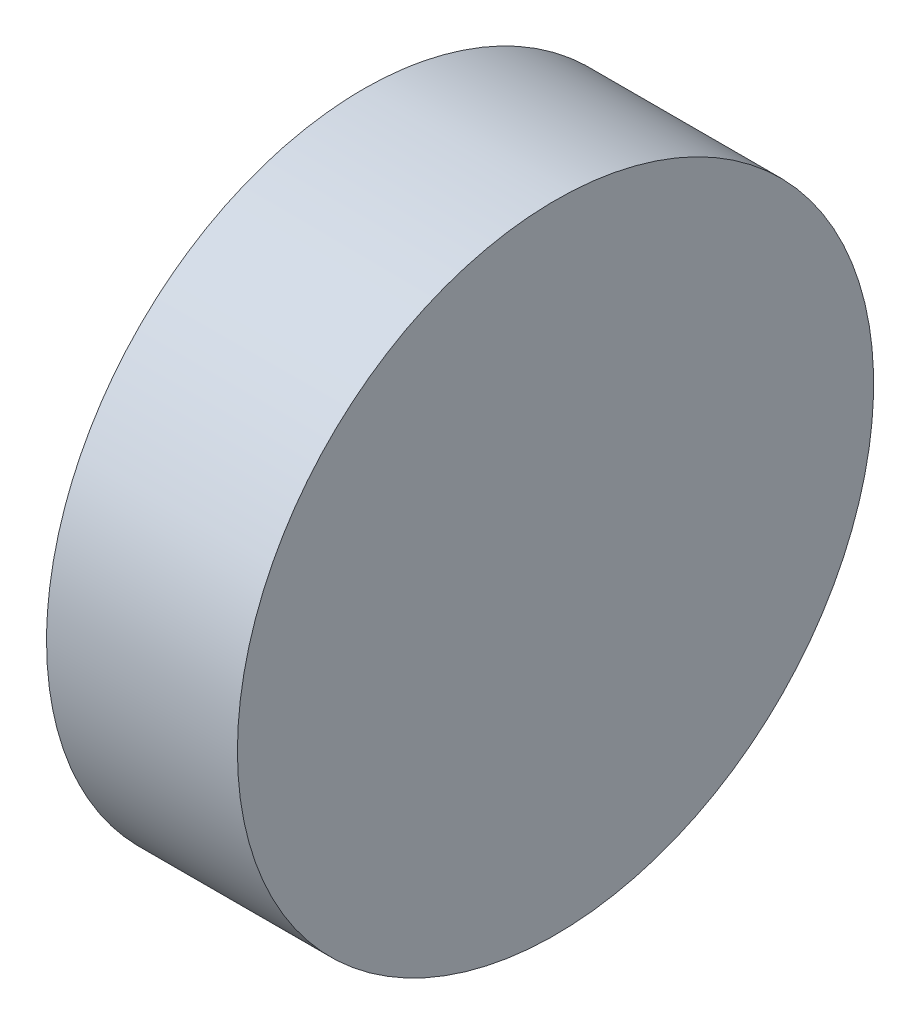
ISO-10303-21;
HEADER;
FILE_DESCRIPTION(('STEP AP214'),'2;1');
FILE_NAME('part.step','',(''),(''),'','','');
FILE_SCHEMA(('AUTOMOTIVE_DESIGN { 1 0 10303 214 1 1 1 1 }'));
ENDSEC;
DATA;
#1=APPLICATION_CONTEXT('core data for automotive mechanical design processes');
#2=APPLICATION_PROTOCOL_DEFINITION('international standard','automotive_design',2000,#1);
#3=PRODUCT_CONTEXT('',#1,'mechanical');
#4=PRODUCT('Part','Part','',(#3));
#5=PRODUCT_RELATED_PRODUCT_CATEGORY('part','',(#4));
#6=PRODUCT_DEFINITION_FORMATION('','',#4);
#7=PRODUCT_DEFINITION_CONTEXT('part definition',#1,'design');
#8=PRODUCT_DEFINITION('design','',#6,#7);
#9=PRODUCT_DEFINITION_SHAPE('','',#8);
#10=(LENGTH_UNIT() NAMED_UNIT(*) SI_UNIT(.MILLI.,.METRE.));
#11=(NAMED_UNIT(*) PLANE_ANGLE_UNIT() SI_UNIT($,.RADIAN.));
#12=(NAMED_UNIT(*) SI_UNIT($,.STERADIAN.) SOLID_ANGLE_UNIT());
#13=UNCERTAINTY_MEASURE_WITH_UNIT(LENGTH_MEASURE(1.E-05),#10,'distance_accuracy_value','');
#14=(GEOMETRIC_REPRESENTATION_CONTEXT(3) GLOBAL_UNCERTAINTY_ASSIGNED_CONTEXT((#13)) GLOBAL_UNIT_ASSIGNED_CONTEXT((#10,
#11,#12)) REPRESENTATION_CONTEXT('',''));
#15=CARTESIAN_POINT('',(0.,0.,0.));
#16=DIRECTION('',(0.,0.,1.));
#17=DIRECTION('',(1.,0.,0.));
#18=AXIS2_PLACEMENT_3D('',#15,#16,#17);
#19=CARTESIAN_POINT('',(290.,0.,0.));
#20=DIRECTION('',(-1.,0.,0.));
#21=DIRECTION('',(0.,0.,1.));
#22=AXIS2_PLACEMENT_3D('',#19,#20,#21);
#23=PLANE('',#22);
#24=CARTESIAN_POINT('',(290.,0.,0.));
#25=DIRECTION('',(-1.,0.,0.));
#26=DIRECTION('',(0.,0.,1.));
#27=AXIS2_PLACEMENT_3D('',#24,#25,#26);
#28=CIRCLE('',#27,5.00000000000005);
#29=CARTESIAN_POINT('',(290.,0.,5.00000000000005));
#30=VERTEX_POINT('',#29);
#31=EDGE_CURVE('E18',#30,#30,#28,.T.);
#32=ORIENTED_EDGE('',*,*,#31,.F.);
#33=EDGE_LOOP('',(#32));
#34=FACE_BOUND('',#33,.T.);
#35=ADVANCED_FACE('F15',(#34),#23,.F.);
#36=CARTESIAN_POINT('',(-290.,0.,0.));
#37=DIRECTION('',(-1.,0.,0.));
#38=DIRECTION('',(0.,0.,1.));
#39=AXIS2_PLACEMENT_3D('',#36,#37,#38);
#40=CYLINDRICAL_SURFACE('',#39,5.00000000000005);
#41=CARTESIAN_POINT('',(287.,0.,5.00000000000005));
#42=CARTESIAN_POINT('',(286.999999981893,-0.140367365878147,4.99999922560093));
#43=CARTESIAN_POINT('',(286.999948373774,-0.280760149727647,4.99408415602021));
#44=CARTESIAN_POINT('',(286.999743308953,-0.560605630915635,4.9704581632869));
#45=CARTESIAN_POINT('',(286.99958980206,-0.700057830749343,4.95274142709282));
#46=CARTESIAN_POINT('',(286.999184914271,-0.977216708563061,4.90559261925809));
#47=CARTESIAN_POINT('',(286.998933366381,-1.11491999214275,4.87614055683503));
#48=CARTESIAN_POINT('',(286.998339443499,-1.38740314511742,4.80571768010346));
#49=CARTESIAN_POINT('',(286.997997034341,-1.52218189417507,4.76474253258196));
#50=CARTESIAN_POINT('',(286.997231641569,-1.78764247682955,4.6716266135757));
#51=CARTESIAN_POINT('',(286.996808755776,-1.91832906221594,4.61949938814656));
#52=CARTESIAN_POINT('',(286.995893977859,-2.17489342489322,4.50439943164233));
#53=CARTESIAN_POINT('',(286.995402060321,-2.30076940924831,4.44142270415054));
#54=CARTESIAN_POINT('',(286.994363750313,-2.54666228729309,4.30514267669168));
#55=CARTESIAN_POINT('',(286.993817404082,-2.66668402730323,4.23184812042534));
#56=CARTESIAN_POINT('',(286.992685176768,-2.90017255382093,4.07538413874863));
#57=CARTESIAN_POINT('',(286.992099281172,-3.01363690520538,3.99221107948697));
#58=CARTESIAN_POINT('',(286.990904854575,-3.23313950079651,3.81661626742415));
#59=CARTESIAN_POINT('',(286.990296327014,-3.33917886682271,3.72419591691681));
#60=CARTESIAN_POINT('',(286.98907359239,-3.54313465798267,3.5307169391396));
#61=CARTESIAN_POINT('',(286.988459383312,-3.64104806880368,3.42965513430768));
#62=CARTESIAN_POINT('',(286.98724312,-3.82798547961291,3.21967098600279));
#63=CARTESIAN_POINT('',(286.986641062377,-3.91701198598186,3.11075087382904));
#64=CARTESIAN_POINT('',(286.985465790711,-4.08560554120724,2.88575750325287));
#65=CARTESIAN_POINT('',(286.984892587401,-4.16516908502915,2.76968161840834));
#66=CARTESIAN_POINT('',(286.983791759354,-4.31420348493938,2.53128440896953));
#67=CARTESIAN_POINT('',(286.983264116882,-4.38367827560253,2.40896554440237));
#68=CARTESIAN_POINT('',(286.982268942647,-4.51210203613593,2.15886683542454));
#69=CARTESIAN_POINT('',(286.981801433163,-4.57104710786912,2.03108499020655));
#70=CARTESIAN_POINT('',(286.98094021986,-4.67794075837642,1.77104907632847));
#71=CARTESIAN_POINT('',(286.980546487875,-4.72589353514795,1.63879673718229));
#72=CARTESIAN_POINT('',(286.979843560868,-4.81050406143394,1.37070835534393));
#73=CARTESIAN_POINT('',(286.97953439754,-4.84715757699518,1.23487098995195));
#74=CARTESIAN_POINT('',(286.978748253043,-4.93969382620417,0.823551460763388));
#75=CARTESIAN_POINT('',(286.978411630984,-4.9782706665177,0.543973005395459));
#76=CARTESIAN_POINT('',(286.97815417355,-5.0078710506189,-0.0176901866871297));
#77=CARTESIAN_POINT('',(286.978233338098,-4.99889460319082,-0.299774922938808));
#78=CARTESIAN_POINT('',(286.978655177376,-4.95010581369642,-0.718535537296324));
#79=CARTESIAN_POINT('',(286.978846484831,-4.92793473976195,-0.857465967581369));
#80=CARTESIAN_POINT('',(286.979324247417,-4.87197592568251,-1.13294880611333));
#81=CARTESIAN_POINT('',(286.979610666925,-4.83819253473607,-1.26950208459368));
#82=CARTESIAN_POINT('',(286.980270810566,-4.75922994560583,-1.53932004286248));
#83=CARTESIAN_POINT('',(286.98064456806,-4.71404639241269,-1.67258344446825));
#84=CARTESIAN_POINT('',(286.981468524065,-4.61263067204388,-1.93478331540616));
#85=CARTESIAN_POINT('',(286.981918694299,-4.55640259071734,-2.06372136428352));
#86=CARTESIAN_POINT('',(286.982883010634,-4.43326072631515,-2.31645596667914));
#87=CARTESIAN_POINT('',(286.983397183581,-4.36634245570501,-2.44025033335708));
#88=CARTESIAN_POINT('',(286.98447455179,-4.22233982777125,-2.68171575754857));
#89=CARTESIAN_POINT('',(286.985037728889,-4.14525923160632,-2.79938905815661));
#90=CARTESIAN_POINT('',(286.986197451543,-3.98143741938344,-3.02785742233571));
#91=CARTESIAN_POINT('',(286.986794006503,-3.89469347388024,-3.13865052874035));
#92=CARTESIAN_POINT('',(286.988003177378,-3.71221329777993,-3.3524949302646));
#93=CARTESIAN_POINT('',(286.988615787285,-3.61648039831559,-3.45554906801517));
#94=CARTESIAN_POINT('',(286.989840026499,-3.4166545642655,-3.65324918478189));
#95=CARTESIAN_POINT('',(286.990451655575,-3.31255989085782,-3.74789340630192));
#96=CARTESIAN_POINT('',(286.991656222016,-3.09680770107217,-3.92804347945882));
#97=CARTESIAN_POINT('',(286.992249166191,-2.9851529883206,-4.0135526887998));
#98=CARTESIAN_POINT('',(286.993400267328,-2.75494236868796,-4.17493345373213));
#99=CARTESIAN_POINT('',(286.993958394533,-2.6363807214862,-4.25079682115631));
#100=CARTESIAN_POINT('',(286.995023262765,-2.39333034842515,-4.39223543355226));
#101=CARTESIAN_POINT('',(286.995530022679,-2.26884382599115,-4.45781446483448));
#102=CARTESIAN_POINT('',(286.996478577897,-2.01463481093442,-4.5783246883899));
#103=CARTESIAN_POINT('',(286.996920293929,-1.88490617076017,-4.63324291327126));
#104=CARTESIAN_POINT('',(286.997725306109,-1.62132737083082,-4.73192266750009));
#105=CARTESIAN_POINT('',(286.998088631716,-1.48747878091829,-4.77568838877123));
#106=CARTESIAN_POINT('',(286.998726198293,-1.21680305996955,-4.85171311811144));
#107=CARTESIAN_POINT('',(286.999000590367,-1.07998140702315,-4.88399165286261));
#108=CARTESIAN_POINT('',(286.999453244809,-0.804160854022945,-4.93690484136047));
#109=CARTESIAN_POINT('',(286.999631554477,-0.665163059975374,-4.95754522452637));
#110=CARTESIAN_POINT('',(286.999839312139,-0.438291537270655,-4.98152665367857));
#111=CARTESIAN_POINT('',(286.999899505114,-0.3507811237414,-4.98845199450058));
#112=CARTESIAN_POINT('',(286.999979854705,-0.175517119000054,-4.99768890975715));
#113=CARTESIAN_POINT('',(287.000000011321,-0.0877635277876955,-5.00000048418666));
#114=CARTESIAN_POINT('',(286.999999981893,0.140367365878154,-4.99999922560093));
#115=CARTESIAN_POINT('',(286.999948373774,0.280760149727654,-4.99408415602021));
#116=CARTESIAN_POINT('',(286.999743308953,0.560605630915642,-4.97045816328689));
#117=CARTESIAN_POINT('',(286.99958980206,0.70005783074935,-4.95274142709281));
#118=CARTESIAN_POINT('',(286.999184914271,0.977216708563066,-4.90559261925807));
#119=CARTESIAN_POINT('',(286.998933366381,1.11491999214276,-4.87614055683501));
#120=CARTESIAN_POINT('',(286.998339443499,1.38740314511742,-4.80571768010343));
#121=CARTESIAN_POINT('',(286.997997034341,1.52218189417507,-4.76474253258194));
#122=CARTESIAN_POINT('',(286.997231641569,1.78764247682955,-4.67162661357567));
#123=CARTESIAN_POINT('',(286.996808755776,1.91832906221594,-4.61949938814652));
#124=CARTESIAN_POINT('',(286.995893977859,2.17489342489322,-4.50439943164229));
#125=CARTESIAN_POINT('',(286.995402060321,2.30076940924831,-4.4414227041505));
#126=CARTESIAN_POINT('',(286.994363750313,2.54666228729309,-4.30514267669163));
#127=CARTESIAN_POINT('',(286.993817404081,2.66668402730322,-4.23184812042529));
#128=CARTESIAN_POINT('',(286.992685176768,2.90017255382092,-4.07538413874858));
#129=CARTESIAN_POINT('',(286.992099281172,3.01363690520537,-3.99221107948692));
#130=CARTESIAN_POINT('',(286.990904854575,3.23313950079649,-3.81661626742409));
#131=CARTESIAN_POINT('',(286.990296327014,3.33917886682269,-3.72419591691675));
#132=CARTESIAN_POINT('',(286.98907359239,3.54313465798265,-3.53071693913954));
#133=CARTESIAN_POINT('',(286.988459383312,3.64104806880366,-3.42965513430762));
#134=CARTESIAN_POINT('',(286.98724312,3.82798547961288,-3.21967098600272));
#135=CARTESIAN_POINT('',(286.986641062377,3.91701198598183,-3.11075087382897));
#136=CARTESIAN_POINT('',(286.985465790711,4.08560554120721,-2.8857575032528));
#137=CARTESIAN_POINT('',(286.984892587401,4.16516908502912,-2.76968161840826));
#138=CARTESIAN_POINT('',(286.983791759354,4.31420348493935,-2.53128440896945));
#139=CARTESIAN_POINT('',(286.983264116882,4.38367827560249,-2.4089655444023));
#140=CARTESIAN_POINT('',(286.982268942647,4.51210203613589,-2.15886683542446));
#141=CARTESIAN_POINT('',(286.981801433163,4.57104710786907,-2.03108499020647));
#142=CARTESIAN_POINT('',(286.98094021986,4.67794075837637,-1.77104907632839));
#143=CARTESIAN_POINT('',(286.980546487875,4.7258935351479,-1.63879673718221));
#144=CARTESIAN_POINT('',(286.979843560868,4.81050406143388,-1.37070835534384));
#145=CARTESIAN_POINT('',(286.97953439754,4.84715757699512,-1.23487098995186));
#146=CARTESIAN_POINT('',(286.978748253043,4.9396938262041,-0.8235514607633));
#147=CARTESIAN_POINT('',(286.978411630984,4.97827066651763,-0.543973005395369));
#148=CARTESIAN_POINT('',(286.97815417355,5.00787105061882,0.0176901866872196));
#149=CARTESIAN_POINT('',(286.978233338098,4.99889460319073,0.299774922938897));
#150=CARTESIAN_POINT('',(286.978655177376,4.95010581369633,0.718535537296412));
#151=CARTESIAN_POINT('',(286.978846484831,4.92793473976185,0.857465967581457));
#152=CARTESIAN_POINT('',(286.979324247417,4.87197592568241,1.13294880611342));
#153=CARTESIAN_POINT('',(286.979610666925,4.83819253473596,1.26950208459377));
#154=CARTESIAN_POINT('',(286.980270810566,4.75922994560572,1.53932004286256));
#155=CARTESIAN_POINT('',(286.98064456806,4.71404639241258,1.67258344446833));
#156=CARTESIAN_POINT('',(286.981468524065,4.61263067204376,1.93478331540624));
#157=CARTESIAN_POINT('',(286.981918694299,4.55640259071722,2.0637213642836));
#158=CARTESIAN_POINT('',(286.982883010634,4.43326072631503,2.31645596667922));
#159=CARTESIAN_POINT('',(286.983397183581,4.36634245570489,2.44025033335716));
#160=CARTESIAN_POINT('',(286.98447455179,4.22233982777112,2.68171575754865));
#161=CARTESIAN_POINT('',(286.985037728889,4.14525923160619,2.79938905815669));
#162=CARTESIAN_POINT('',(286.986197451543,3.9814374193833,3.02785742233578));
#163=CARTESIAN_POINT('',(286.986794006503,3.8946934738801,3.13865052874041));
#164=CARTESIAN_POINT('',(286.988003177378,3.71221329777979,3.35249493026467));
#165=CARTESIAN_POINT('',(286.988615787285,3.61648039831544,3.45554906801523));
#166=CARTESIAN_POINT('',(286.989840026499,3.41665456426535,3.65324918478195));
#167=CARTESIAN_POINT('',(286.990451655575,3.31255989085767,3.74789340630198));
#168=CARTESIAN_POINT('',(286.991656222016,3.09680770107202,3.92804347945888));
#169=CARTESIAN_POINT('',(286.992249166191,2.98515298832045,4.01355268879986));
#170=CARTESIAN_POINT('',(286.993400267328,2.75494236868781,4.17493345373218));
#171=CARTESIAN_POINT('',(286.993958394533,2.63638072148604,4.25079682115636));
#172=CARTESIAN_POINT('',(286.995023262765,2.39333034842499,4.39223543355231));
#173=CARTESIAN_POINT('',(286.995530022679,2.26884382599099,4.45781446483452));
#174=CARTESIAN_POINT('',(286.996478577897,2.01463481093425,4.57832468838994));
#175=CARTESIAN_POINT('',(286.996920293929,1.88490617076,4.6332429132713));
#176=CARTESIAN_POINT('',(286.997725306109,1.62132737083065,4.73192266750012));
#177=CARTESIAN_POINT('',(286.998088631716,1.48747878091812,4.77568838877126));
#178=CARTESIAN_POINT('',(286.998726198293,1.21680305996938,4.85171311811146));
#179=CARTESIAN_POINT('',(286.999000590367,1.07998140702298,4.88399165286263));
#180=CARTESIAN_POINT('',(286.999453244809,0.804160854022774,4.93690484136048));
#181=CARTESIAN_POINT('',(286.999631554477,0.665163059975203,4.95754522452639));
#182=CARTESIAN_POINT('',(286.999839312139,0.438291537270513,4.98152665367857));
#183=CARTESIAN_POINT('',(286.999899505114,0.350781123741289,4.98845199450058));
#184=CARTESIAN_POINT('',(286.999979854705,0.175517119000001,4.99768890975715));
#185=CARTESIAN_POINT('',(287.000000011321,0.0877635277876731,5.00000048418666));
#186=CARTESIAN_POINT('',(287.,0.,5.00000000000005));
#187=B_SPLINE_CURVE_WITH_KNOTS('',3,(#41,#42,#43,#44,#45,#46,#47,#48,#49,#50,#51,#52,#53,#54,
#55,#56,#57,#58,#59,#60,#61,#62,#63,#64,#65,#66,#67,#68,#69,#70,#71,#72,#73,#74,#75,#76,#77,#78,
#79,#80,#81,#82,#83,#84,#85,#86,#87,#88,#89,#90,#91,#92,#93,#94,#95,#96,#97,#98,#99,#100,#101,
#102,#103,#104,#105,#106,#107,#108,#109,#110,#111,#112,#113,#114,#115,#116,#117,#118,#119,#120,
#121,#122,#123,#124,#125,#126,#127,#128,#129,#130,#131,#132,#133,#134,#135,#136,#137,#138,#139,
#140,#141,#142,#143,#144,#145,#146,#147,#148,#149,#150,#151,#152,#153,#154,#155,#156,#157,#158,
#159,#160,#161,#162,#163,#164,#165,#166,#167,#168,#169,#170,#171,#172,#173,#174,#175,#176,#177,
#178,#179,#180,#181,#182,#183,#184,#185,#186),.UNSPECIFIED.,.T.,.F.,(4,2,2,2,2,2,2,2,2,2,2,2,2,
2,2,2,2,2,2,2,2,2,2,2,2,2,2,2,2,2,2,2,2,2,2,2,2,2,2,2,2,2,2,2,2,2,2,2,2,2,2,2,2,2,2,2,2,2,2,2,2,
2,2,2,2,2,2,2,2,2,2,2,4),(0.,0.421021756862898,0.842251046145447,1.26420097595996,
1.68630979112951,2.10790876673806,2.52966337177587,2.9510626945574,3.37261751387892,
3.79410850365764,4.21575515256511,4.63728254614672,5.05896558834035,5.48048373154248,
5.90215760022878,6.32367016083706,6.74534047523101,7.58775647664785,8.43017232244993,
8.85182022870838,9.27331038558106,9.69496180157749,10.1164575232508,10.5381306478703,
10.9596481436929,11.3812850018622,11.8027662216319,12.224335315998,12.6457489195887,
13.0675178979741,13.4891312302967,13.9112542267675,14.3332183238333,14.7544616730758,
15.1754974643014,15.4387378149773,15.7019781659414,16.1229999228043,16.5442292120868,
16.9661791419013,17.3882879570709,17.8098869326794,18.2316415377173,18.6530408604988,
19.0745956798203,19.496086669599,19.9177333185065,20.3392607120881,20.7609437542817,
21.1824618974839,21.6041357661702,22.0256483267784,22.4473186411724,23.2897346425892,
24.1321504883913,24.5537983946498,24.9752885515224,25.3969399675189,25.8184356891922,
26.2401088138116,26.6616263096343,27.0832631678035,27.5047443875733,27.9263134819394,
28.3477270855301,28.7694960639155,29.1911093962381,29.6132323927089,30.0351964897747,
30.4564398390172,30.8774756302428,31.1407159809186,31.4039563318826),.UNSPECIFIED.);
#188=CARTESIAN_POINT('',(287.,0.,5.00000000000005));
#189=VERTEX_POINT('',#188);
#190=EDGE_CURVE('E10',#189,#189,#187,.T.);
#191=ORIENTED_EDGE('',*,*,#190,.T.);
#192=EDGE_LOOP('',(#191));
#193=FACE_BOUND('',#192,.T.);
#194=ORIENTED_EDGE('',*,*,#31,.T.);
#195=EDGE_LOOP('',(#194));
#196=FACE_BOUND('',#195,.T.);
#197=ADVANCED_FACE('F30',(#193,#196),#40,.T.);
#198=CARTESIAN_POINT('',(-287.,0.,-9.97151619509019));
#199=DIRECTION('',(0.,0.,-1.));
#200=DIRECTION('',(-1.,0.,0.));
#201=AXIS2_PLACEMENT_3D('',#198,#199,#200);
#202=CYLINDRICAL_SURFACE('',#201,574.);
#203=ORIENTED_EDGE('',*,*,#190,.F.);
#204=EDGE_LOOP('',(#203));
#205=FACE_BOUND('',#204,.T.);
#206=ADVANCED_FACE('F28',(#205),#202,.F.);
#207=CLOSED_SHELL('',(#35,#197,#206));
#208=MANIFOLD_SOLID_BREP('B1',#207);
#209=ADVANCED_BREP_SHAPE_REPRESENTATION('',(#18,#208),#14);
#210=SHAPE_DEFINITION_REPRESENTATION(#9,#209);
ENDSEC;
END-ISO-10303-21;
